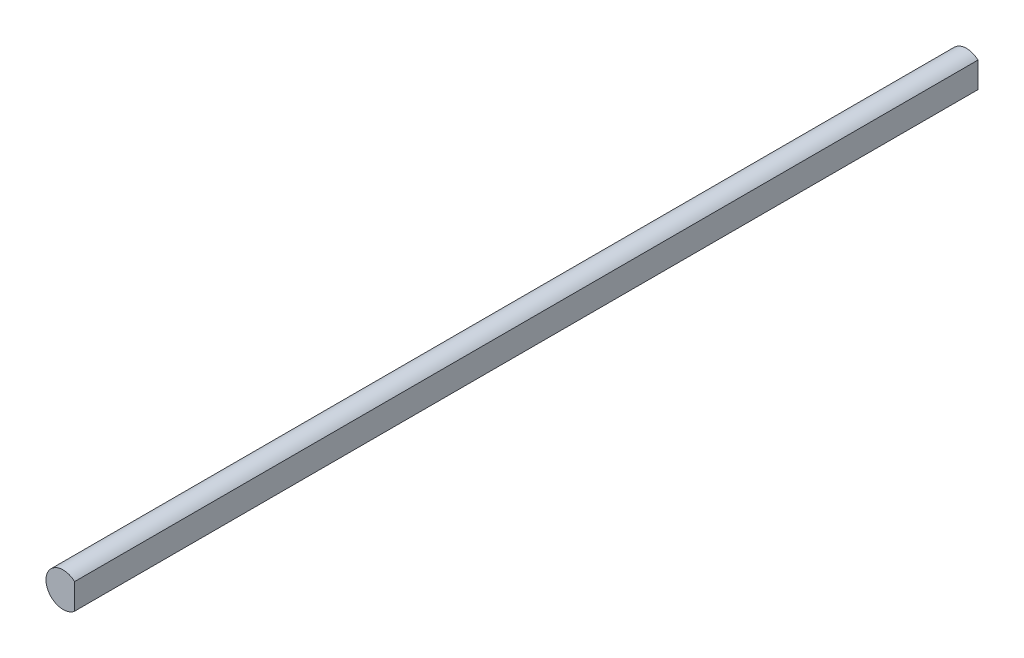
ISO-10303-21;
HEADER;
FILE_DESCRIPTION(('STEP AP214'),'2;1');
FILE_NAME('part.step','',(''),(''),'','','');
FILE_SCHEMA(('AUTOMOTIVE_DESIGN { 1 0 10303 214 1 1 1 1 }'));
ENDSEC;
DATA;
#1=APPLICATION_CONTEXT('core data for automotive mechanical design processes');
#2=APPLICATION_PROTOCOL_DEFINITION('international standard','automotive_design',2000,#1);
#3=PRODUCT_CONTEXT('',#1,'mechanical');
#4=PRODUCT('Part','Part','',(#3));
#5=PRODUCT_RELATED_PRODUCT_CATEGORY('part','',(#4));
#6=PRODUCT_DEFINITION_FORMATION('','',#4);
#7=PRODUCT_DEFINITION_CONTEXT('part definition',#1,'design');
#8=PRODUCT_DEFINITION('design','',#6,#7);
#9=PRODUCT_DEFINITION_SHAPE('','',#8);
#10=(LENGTH_UNIT() NAMED_UNIT(*) SI_UNIT(.MILLI.,.METRE.));
#11=(NAMED_UNIT(*) PLANE_ANGLE_UNIT() SI_UNIT($,.RADIAN.));
#12=(NAMED_UNIT(*) SI_UNIT($,.STERADIAN.) SOLID_ANGLE_UNIT());
#13=UNCERTAINTY_MEASURE_WITH_UNIT(LENGTH_MEASURE(1.E-05),#10,'distance_accuracy_value','');
#14=(GEOMETRIC_REPRESENTATION_CONTEXT(3) GLOBAL_UNCERTAINTY_ASSIGNED_CONTEXT((#13)) GLOBAL_UNIT_ASSIGNED_CONTEXT((#10,
#11,#12)) REPRESENTATION_CONTEXT('',''));
#15=CARTESIAN_POINT('',(0.,0.,0.));
#16=DIRECTION('',(0.,0.,1.));
#17=DIRECTION('',(1.,0.,0.));
#18=AXIS2_PLACEMENT_3D('',#15,#16,#17);
#19=CARTESIAN_POINT('',(1.,0.,78.8));
#20=DIRECTION('',(1.,0.,0.));
#21=DIRECTION('',(0.,0.,-1.));
#22=AXIS2_PLACEMENT_3D('',#19,#20,#21);
#23=PLANE('',#22);
#24=DIRECTION('',(0.,-1.,0.));
#25=VECTOR('',#24,1.);
#26=CARTESIAN_POINT('',(1.,0.,0.));
#27=LINE('',#26,#25);
#28=CARTESIAN_POINT('',(1.,1.11803398874991,0.));
#29=VERTEX_POINT('',#28);
#30=CARTESIAN_POINT('',(1.,-1.11803398874991,0.));
#31=VERTEX_POINT('',#30);
#32=EDGE_CURVE('E67',#29,#31,#27,.T.);
#33=ORIENTED_EDGE('',*,*,#32,.F.);
#34=DIRECTION('',(0.,0.,-1.));
#35=VECTOR('',#34,1.);
#36=CARTESIAN_POINT('',(1.,1.11803398874991,78.8));
#37=LINE('',#36,#35);
#38=CARTESIAN_POINT('',(1.,1.11803398874991,78.8));
#39=VERTEX_POINT('',#38);
#40=EDGE_CURVE('E11',#39,#29,#37,.T.);
#41=ORIENTED_EDGE('',*,*,#40,.F.);
#42=DIRECTION('',(0.,-1.,0.));
#43=VECTOR('',#42,1.);
#44=CARTESIAN_POINT('',(1.,0.,78.8));
#45=LINE('',#44,#43);
#46=CARTESIAN_POINT('',(1.,-1.11803398874991,78.8));
#47=VERTEX_POINT('',#46);
#48=EDGE_CURVE('E68',#39,#47,#45,.T.);
#49=ORIENTED_EDGE('',*,*,#48,.T.);
#50=DIRECTION('',(0.,0.,-1.));
#51=VECTOR('',#50,1.);
#52=CARTESIAN_POINT('',(1.,-1.11803398874991,78.8));
#53=LINE('',#52,#51);
#54=EDGE_CURVE('E47',#47,#31,#53,.T.);
#55=ORIENTED_EDGE('',*,*,#54,.T.);
#56=EDGE_LOOP('',(#33,#41,#49,#55));
#57=FACE_BOUND('',#56,.T.);
#58=ADVANCED_FACE('F39',(#57),#23,.T.);
#59=CARTESIAN_POINT('',(0.,0.,78.8));
#60=DIRECTION('',(0.,0.,-1.));
#61=DIRECTION('',(-1.,0.,0.));
#62=AXIS2_PLACEMENT_3D('',#59,#60,#61);
#63=CYLINDRICAL_SURFACE('',#62,1.5);
#64=CARTESIAN_POINT('',(0.,0.,0.));
#65=DIRECTION('',(0.,0.,1.));
#66=DIRECTION('',(1.,0.,0.));
#67=AXIS2_PLACEMENT_3D('',#64,#65,#66);
#68=CIRCLE('',#67,1.5);
#69=EDGE_CURVE('E69',#29,#31,#68,.T.);
#70=ORIENTED_EDGE('',*,*,#69,.T.);
#71=ORIENTED_EDGE('',*,*,#54,.F.);
#72=CARTESIAN_POINT('',(0.,0.,78.8));
#73=DIRECTION('',(0.,0.,1.));
#74=DIRECTION('',(1.,0.,0.));
#75=AXIS2_PLACEMENT_3D('',#72,#73,#74);
#76=CIRCLE('',#75,1.5);
#77=EDGE_CURVE('E54',#39,#47,#76,.T.);
#78=ORIENTED_EDGE('',*,*,#77,.F.);
#79=ORIENTED_EDGE('',*,*,#40,.T.);
#80=EDGE_LOOP('',(#70,#71,#78,#79));
#81=FACE_BOUND('',#80,.T.);
#82=ADVANCED_FACE('F70',(#81),#63,.T.);
#83=CARTESIAN_POINT('',(0.,0.,78.8));
#84=DIRECTION('',(0.,0.,1.));
#85=DIRECTION('',(1.,0.,0.));
#86=AXIS2_PLACEMENT_3D('',#83,#84,#85);
#87=PLANE('',#86);
#88=ORIENTED_EDGE('',*,*,#48,.F.);
#89=ORIENTED_EDGE('',*,*,#77,.T.);
#90=EDGE_LOOP('',(#88,#89));
#91=FACE_BOUND('',#90,.T.);
#92=ADVANCED_FACE('F78',(#91),#87,.T.);
#93=CARTESIAN_POINT('',(0.,0.,0.));
#94=DIRECTION('',(0.,0.,1.));
#95=DIRECTION('',(1.,0.,0.));
#96=AXIS2_PLACEMENT_3D('',#93,#94,#95);
#97=PLANE('',#96);
#98=ORIENTED_EDGE('',*,*,#32,.T.);
#99=ORIENTED_EDGE('',*,*,#69,.F.);
#100=EDGE_LOOP('',(#98,#99));
#101=FACE_BOUND('',#100,.T.);
#102=ADVANCED_FACE('F73',(#101),#97,.F.);
#103=CLOSED_SHELL('',(#58,#82,#92,#102));
#104=MANIFOLD_SOLID_BREP('B2',#103);
#105=ADVANCED_BREP_SHAPE_REPRESENTATION('',(#18,#104),#14);
#106=SHAPE_DEFINITION_REPRESENTATION(#9,#105);
ENDSEC;
END-ISO-10303-21;
